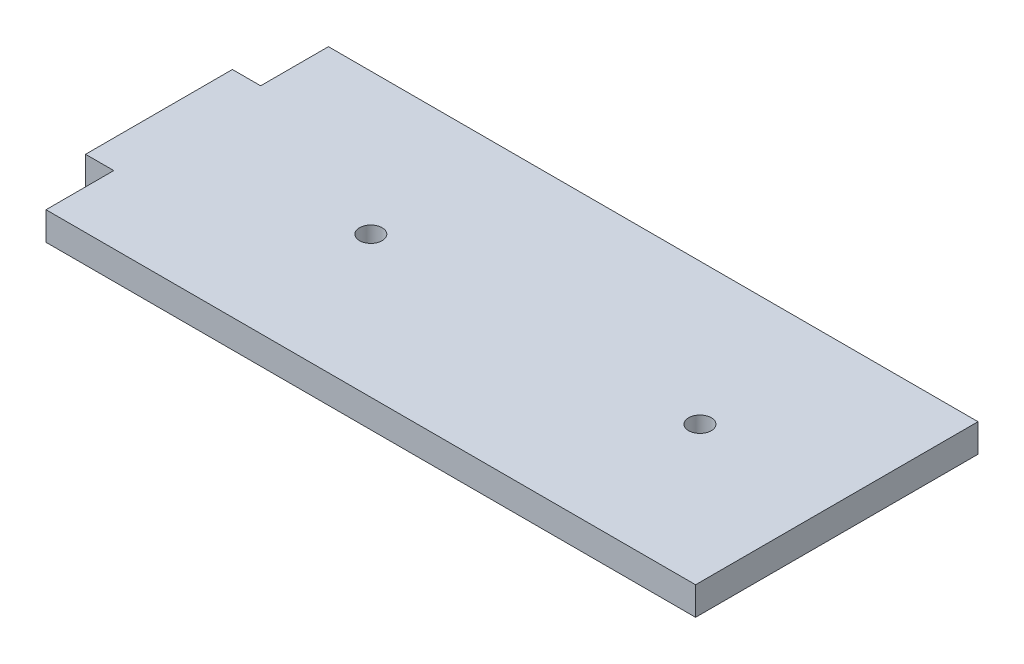
ISO-10303-21;
HEADER;
FILE_DESCRIPTION(('STEP AP214'),'2;1');
FILE_NAME('part.step','',(''),(''),'','','');
FILE_SCHEMA(('AUTOMOTIVE_DESIGN { 1 0 10303 214 1 1 1 1 }'));
ENDSEC;
DATA;
#1=APPLICATION_CONTEXT('core data for automotive mechanical design processes');
#2=APPLICATION_PROTOCOL_DEFINITION('international standard','automotive_design',2000,#1);
#3=PRODUCT_CONTEXT('',#1,'mechanical');
#4=PRODUCT('Part','Part','',(#3));
#5=PRODUCT_RELATED_PRODUCT_CATEGORY('part','',(#4));
#6=PRODUCT_DEFINITION_FORMATION('','',#4);
#7=PRODUCT_DEFINITION_CONTEXT('part definition',#1,'design');
#8=PRODUCT_DEFINITION('design','',#6,#7);
#9=PRODUCT_DEFINITION_SHAPE('','',#8);
#10=(LENGTH_UNIT() NAMED_UNIT(*) SI_UNIT(.MILLI.,.METRE.));
#11=(NAMED_UNIT(*) PLANE_ANGLE_UNIT() SI_UNIT($,.RADIAN.));
#12=(NAMED_UNIT(*) SI_UNIT($,.STERADIAN.) SOLID_ANGLE_UNIT());
#13=UNCERTAINTY_MEASURE_WITH_UNIT(LENGTH_MEASURE(1.E-05),#10,'distance_accuracy_value','');
#14=(GEOMETRIC_REPRESENTATION_CONTEXT(3) GLOBAL_UNCERTAINTY_ASSIGNED_CONTEXT((#13)) GLOBAL_UNIT_ASSIGNED_CONTEXT((#10,
#11,#12)) REPRESENTATION_CONTEXT('',''));
#15=CARTESIAN_POINT('',(0.,0.,0.));
#16=DIRECTION('',(0.,0.,1.));
#17=DIRECTION('',(1.,0.,0.));
#18=AXIS2_PLACEMENT_3D('',#15,#16,#17);
#19=CARTESIAN_POINT('',(38.1,3.175,-15.875));
#20=DIRECTION('',(-1.,0.,0.));
#21=DIRECTION('',(0.,0.,1.));
#22=AXIS2_PLACEMENT_3D('',#19,#20,#21);
#23=PLANE('',#22);
#24=DIRECTION('',(0.,0.,-1.));
#25=VECTOR('',#24,1.);
#26=CARTESIAN_POINT('',(38.1,0.,-15.875));
#27=LINE('',#26,#25);
#28=CARTESIAN_POINT('',(38.1,0.,15.875));
#29=VERTEX_POINT('',#28);
#30=CARTESIAN_POINT('',(38.1,0.,-15.875));
#31=VERTEX_POINT('',#30);
#32=EDGE_CURVE('E143',#29,#31,#27,.T.);
#33=ORIENTED_EDGE('',*,*,#32,.T.);
#34=DIRECTION('',(0.,-1.,0.));
#35=VECTOR('',#34,1.);
#36=CARTESIAN_POINT('',(38.1,3.175,-15.875));
#37=LINE('',#36,#35);
#38=CARTESIAN_POINT('',(38.1,3.175,-15.875));
#39=VERTEX_POINT('',#38);
#40=EDGE_CURVE('E11',#39,#31,#37,.T.);
#41=ORIENTED_EDGE('',*,*,#40,.F.);
#42=DIRECTION('',(0.,0.,-1.));
#43=VECTOR('',#42,1.);
#44=CARTESIAN_POINT('',(38.1,3.175,-15.875));
#45=LINE('',#44,#43);
#46=CARTESIAN_POINT('',(38.1,3.175,15.875));
#47=VERTEX_POINT('',#46);
#48=EDGE_CURVE('E147',#47,#39,#45,.T.);
#49=ORIENTED_EDGE('',*,*,#48,.F.);
#50=DIRECTION('',(0.,-1.,0.));
#51=VECTOR('',#50,1.);
#52=CARTESIAN_POINT('',(38.1,3.175,15.875));
#53=LINE('',#52,#51);
#54=EDGE_CURVE('E42',#47,#29,#53,.T.);
#55=ORIENTED_EDGE('',*,*,#54,.T.);
#56=EDGE_LOOP('',(#33,#41,#49,#55));
#57=FACE_BOUND('',#56,.T.);
#58=ADVANCED_FACE('F35',(#57),#23,.F.);
#59=CARTESIAN_POINT('',(-38.1,3.175,-15.875));
#60=DIRECTION('',(0.,0.,1.));
#61=DIRECTION('',(1.,0.,0.));
#62=AXIS2_PLACEMENT_3D('',#59,#60,#61);
#63=PLANE('',#62);
#64=DIRECTION('',(-1.,0.,0.));
#65=VECTOR('',#64,1.);
#66=CARTESIAN_POINT('',(-38.1,0.,-15.875));
#67=LINE('',#66,#65);
#68=CARTESIAN_POINT('',(-34.925,0.,-15.875));
#69=VERTEX_POINT('',#68);
#70=EDGE_CURVE('E160',#31,#69,#67,.T.);
#71=ORIENTED_EDGE('',*,*,#70,.T.);
#72=DIRECTION('',(0.,1.,0.));
#73=VECTOR('',#72,1.);
#74=CARTESIAN_POINT('',(-34.925,0.,-15.875));
#75=LINE('',#74,#73);
#76=CARTESIAN_POINT('',(-34.925,3.175,-15.875));
#77=VERTEX_POINT('',#76);
#78=EDGE_CURVE('E140',#69,#77,#75,.T.);
#79=ORIENTED_EDGE('',*,*,#78,.T.);
#80=DIRECTION('',(-1.,0.,0.));
#81=VECTOR('',#80,1.);
#82=CARTESIAN_POINT('',(-38.1,3.175,-15.875));
#83=LINE('',#82,#81);
#84=EDGE_CURVE('E150',#39,#77,#83,.T.);
#85=ORIENTED_EDGE('',*,*,#84,.F.);
#86=ORIENTED_EDGE('',*,*,#40,.T.);
#87=EDGE_LOOP('',(#71,#79,#85,#86));
#88=FACE_BOUND('',#87,.T.);
#89=ADVANCED_FACE('F173',(#88),#63,.F.);
#90=CARTESIAN_POINT('',(-38.1,3.175,-15.875));
#91=DIRECTION('',(1.,0.,0.));
#92=DIRECTION('',(0.,0.,-1.));
#93=AXIS2_PLACEMENT_3D('',#90,#91,#92);
#94=PLANE('',#93);
#95=DIRECTION('',(0.,0.,1.));
#96=VECTOR('',#95,1.);
#97=CARTESIAN_POINT('',(-38.1,0.,-15.875));
#98=LINE('',#97,#96);
#99=CARTESIAN_POINT('',(-38.1,0.,-8.255));
#100=VERTEX_POINT('',#99);
#101=CARTESIAN_POINT('',(-38.1,0.,8.25500000000001));
#102=VERTEX_POINT('',#101);
#103=EDGE_CURVE('E163',#100,#102,#98,.T.);
#104=ORIENTED_EDGE('',*,*,#103,.T.);
#105=DIRECTION('',(0.,1.,0.));
#106=VECTOR('',#105,1.);
#107=CARTESIAN_POINT('',(-38.1,0.,8.25500000000001));
#108=LINE('',#107,#106);
#109=CARTESIAN_POINT('',(-38.1,3.175,8.25500000000001));
#110=VERTEX_POINT('',#109);
#111=EDGE_CURVE('E49',#102,#110,#108,.T.);
#112=ORIENTED_EDGE('',*,*,#111,.T.);
#113=DIRECTION('',(0.,0.,1.));
#114=VECTOR('',#113,1.);
#115=CARTESIAN_POINT('',(-38.1,3.175,-15.875));
#116=LINE('',#115,#114);
#117=CARTESIAN_POINT('',(-38.1,3.175,-8.255));
#118=VERTEX_POINT('',#117);
#119=EDGE_CURVE('E153',#118,#110,#116,.T.);
#120=ORIENTED_EDGE('',*,*,#119,.F.);
#121=DIRECTION('',(0.,1.,0.));
#122=VECTOR('',#121,1.);
#123=CARTESIAN_POINT('',(-38.1,0.,-8.255));
#124=LINE('',#123,#122);
#125=EDGE_CURVE('E136',#100,#118,#124,.T.);
#126=ORIENTED_EDGE('',*,*,#125,.F.);
#127=EDGE_LOOP('',(#104,#112,#120,#126));
#128=FACE_BOUND('',#127,.T.);
#129=ADVANCED_FACE('F179',(#128),#94,.F.);
#130=CARTESIAN_POINT('',(-38.1,3.175,15.875));
#131=DIRECTION('',(0.,0.,-1.));
#132=DIRECTION('',(-1.,0.,0.));
#133=AXIS2_PLACEMENT_3D('',#130,#131,#132);
#134=PLANE('',#133);
#135=DIRECTION('',(1.,0.,0.));
#136=VECTOR('',#135,1.);
#137=CARTESIAN_POINT('',(-38.1,3.175,15.875));
#138=LINE('',#137,#136);
#139=CARTESIAN_POINT('',(-34.925,3.175,15.875));
#140=VERTEX_POINT('',#139);
#141=EDGE_CURVE('E156',#140,#47,#138,.T.);
#142=ORIENTED_EDGE('',*,*,#141,.F.);
#143=DIRECTION('',(0.,1.,0.));
#144=VECTOR('',#143,1.);
#145=CARTESIAN_POINT('',(-34.925,0.,15.875));
#146=LINE('',#145,#144);
#147=CARTESIAN_POINT('',(-34.925,0.,15.875));
#148=VERTEX_POINT('',#147);
#149=EDGE_CURVE('E127',#148,#140,#146,.T.);
#150=ORIENTED_EDGE('',*,*,#149,.F.);
#151=DIRECTION('',(1.,0.,0.));
#152=VECTOR('',#151,1.);
#153=CARTESIAN_POINT('',(-38.1,0.,15.875));
#154=LINE('',#153,#152);
#155=EDGE_CURVE('E117',#148,#29,#154,.T.);
#156=ORIENTED_EDGE('',*,*,#155,.T.);
#157=ORIENTED_EDGE('',*,*,#54,.F.);
#158=EDGE_LOOP('',(#142,#150,#156,#157));
#159=FACE_BOUND('',#158,.T.);
#160=ADVANCED_FACE('F177',(#159),#134,.F.);
#161=CARTESIAN_POINT('',(0.,3.175,0.));
#162=DIRECTION('',(0.,1.,0.));
#163=DIRECTION('',(0.,0.,1.));
#164=AXIS2_PLACEMENT_3D('',#161,#162,#163);
#165=PLANE('',#164);
#166=CARTESIAN_POINT('',(22.7196874789622,3.175,0.));
#167=DIRECTION('',(0.,1.,0.));
#168=DIRECTION('',(0.,0.,1.));
#169=AXIS2_PLACEMENT_3D('',#166,#167,#168);
#170=CIRCLE('',#169,1.27);
#171=CARTESIAN_POINT('',(22.7196874789622,3.175,1.27));
#172=VERTEX_POINT('',#171);
#173=EDGE_CURVE('E283',#172,#172,#170,.T.);
#174=ORIENTED_EDGE('',*,*,#173,.F.);
#175=EDGE_LOOP('',(#174));
#176=FACE_BOUND('',#175,.T.);
#177=CARTESIAN_POINT('',(-14.2803125210378,3.175,0.));
#178=DIRECTION('',(0.,1.,0.));
#179=DIRECTION('',(0.,0.,1.));
#180=AXIS2_PLACEMENT_3D('',#177,#178,#179);
#181=CIRCLE('',#180,1.27);
#182=CARTESIAN_POINT('',(-14.2803125210378,3.175,1.27));
#183=VERTEX_POINT('',#182);
#184=EDGE_CURVE('E122',#183,#183,#181,.T.);
#185=ORIENTED_EDGE('',*,*,#184,.F.);
#186=EDGE_LOOP('',(#185));
#187=FACE_BOUND('',#186,.T.);
#188=DIRECTION('',(0.,0.,-1.));
#189=VECTOR('',#188,1.);
#190=CARTESIAN_POINT('',(-34.925,3.175,8.25500000000001));
#191=LINE('',#190,#189);
#192=CARTESIAN_POINT('',(-34.925,3.175,8.25500000000001));
#193=VERTEX_POINT('',#192);
#194=EDGE_CURVE('E105',#140,#193,#191,.T.);
#195=ORIENTED_EDGE('',*,*,#194,.F.);
#196=ORIENTED_EDGE('',*,*,#141,.T.);
#197=ORIENTED_EDGE('',*,*,#48,.T.);
#198=ORIENTED_EDGE('',*,*,#84,.T.);
#199=DIRECTION('',(0.,0.,-1.));
#200=VECTOR('',#199,1.);
#201=CARTESIAN_POINT('',(-34.925,3.175,-8.255));
#202=LINE('',#201,#200);
#203=CARTESIAN_POINT('',(-34.925,3.175,-8.255));
#204=VERTEX_POINT('',#203);
#205=EDGE_CURVE('E134',#204,#77,#202,.T.);
#206=ORIENTED_EDGE('',*,*,#205,.F.);
#207=DIRECTION('',(1.,0.,0.));
#208=VECTOR('',#207,1.);
#209=CARTESIAN_POINT('',(-34.925,3.175,-8.255));
#210=LINE('',#209,#208);
#211=EDGE_CURVE('E129',#118,#204,#210,.T.);
#212=ORIENTED_EDGE('',*,*,#211,.F.);
#213=ORIENTED_EDGE('',*,*,#119,.T.);
#214=DIRECTION('',(-1.,0.,0.));
#215=VECTOR('',#214,1.);
#216=CARTESIAN_POINT('',(-34.925,3.175,8.25500000000001));
#217=LINE('',#216,#215);
#218=EDGE_CURVE('E118',#193,#110,#217,.T.);
#219=ORIENTED_EDGE('',*,*,#218,.F.);
#220=EDGE_LOOP('',(#195,#196,#197,#198,#206,#212,#213,#219));
#221=FACE_BOUND('',#220,.T.);
#222=ADVANCED_FACE('F176',(#176,#187,#221),#165,.T.);
#223=CARTESIAN_POINT('',(0.,0.,0.));
#224=DIRECTION('',(0.,1.,0.));
#225=DIRECTION('',(0.,0.,1.));
#226=AXIS2_PLACEMENT_3D('',#223,#224,#225);
#227=PLANE('',#226);
#228=CARTESIAN_POINT('',(22.7196874789622,0.,0.));
#229=DIRECTION('',(0.,1.,0.));
#230=DIRECTION('',(0.,0.,1.));
#231=AXIS2_PLACEMENT_3D('',#228,#229,#230);
#232=CIRCLE('',#231,1.27);
#233=CARTESIAN_POINT('',(22.7196874789622,0.,1.27));
#234=VERTEX_POINT('',#233);
#235=EDGE_CURVE('E280',#234,#234,#232,.T.);
#236=ORIENTED_EDGE('',*,*,#235,.T.);
#237=EDGE_LOOP('',(#236));
#238=FACE_BOUND('',#237,.T.);
#239=CARTESIAN_POINT('',(-14.2803125210378,0.,0.));
#240=DIRECTION('',(0.,1.,0.));
#241=DIRECTION('',(0.,0.,1.));
#242=AXIS2_PLACEMENT_3D('',#239,#240,#241);
#243=CIRCLE('',#242,1.27);
#244=CARTESIAN_POINT('',(-14.2803125210378,0.,1.27));
#245=VERTEX_POINT('',#244);
#246=EDGE_CURVE('E125',#245,#245,#243,.T.);
#247=ORIENTED_EDGE('',*,*,#246,.T.);
#248=EDGE_LOOP('',(#247));
#249=FACE_BOUND('',#248,.T.);
#250=ORIENTED_EDGE('',*,*,#155,.F.);
#251=DIRECTION('',(0.,0.,-1.));
#252=VECTOR('',#251,1.);
#253=CARTESIAN_POINT('',(-34.925,0.,8.25500000000001));
#254=LINE('',#253,#252);
#255=CARTESIAN_POINT('',(-34.925,0.,8.25500000000001));
#256=VERTEX_POINT('',#255);
#257=EDGE_CURVE('E102',#148,#256,#254,.T.);
#258=ORIENTED_EDGE('',*,*,#257,.T.);
#259=DIRECTION('',(-1.,0.,0.));
#260=VECTOR('',#259,1.);
#261=CARTESIAN_POINT('',(-34.925,0.,8.25500000000001));
#262=LINE('',#261,#260);
#263=EDGE_CURVE('E107',#256,#102,#262,.T.);
#264=ORIENTED_EDGE('',*,*,#263,.T.);
#265=ORIENTED_EDGE('',*,*,#103,.F.);
#266=DIRECTION('',(1.,0.,0.));
#267=VECTOR('',#266,1.);
#268=CARTESIAN_POINT('',(-34.925,0.,-8.255));
#269=LINE('',#268,#267);
#270=CARTESIAN_POINT('',(-34.925,0.,-8.255));
#271=VERTEX_POINT('',#270);
#272=EDGE_CURVE('E131',#100,#271,#269,.T.);
#273=ORIENTED_EDGE('',*,*,#272,.T.);
#274=DIRECTION('',(0.,0.,-1.));
#275=VECTOR('',#274,1.);
#276=CARTESIAN_POINT('',(-34.925,0.,-8.255));
#277=LINE('',#276,#275);
#278=EDGE_CURVE('E57',#271,#69,#277,.T.);
#279=ORIENTED_EDGE('',*,*,#278,.T.);
#280=ORIENTED_EDGE('',*,*,#70,.F.);
#281=ORIENTED_EDGE('',*,*,#32,.F.);
#282=EDGE_LOOP('',(#250,#258,#264,#265,#273,#279,#280,#281));
#283=FACE_BOUND('',#282,.T.);
#284=ADVANCED_FACE('F115',(#238,#249,#283),#227,.F.);
#285=CARTESIAN_POINT('',(-34.925,0.,-8.255));
#286=DIRECTION('',(1.,0.,0.));
#287=DIRECTION('',(0.,0.,-1.));
#288=AXIS2_PLACEMENT_3D('',#285,#286,#287);
#289=PLANE('',#288);
#290=ORIENTED_EDGE('',*,*,#205,.T.);
#291=ORIENTED_EDGE('',*,*,#78,.F.);
#292=ORIENTED_EDGE('',*,*,#278,.F.);
#293=DIRECTION('',(0.,1.,0.));
#294=VECTOR('',#293,1.);
#295=CARTESIAN_POINT('',(-34.925,0.,-8.255));
#296=LINE('',#295,#294);
#297=EDGE_CURVE('E144',#271,#204,#296,.T.);
#298=ORIENTED_EDGE('',*,*,#297,.T.);
#299=EDGE_LOOP('',(#290,#291,#292,#298));
#300=FACE_BOUND('',#299,.T.);
#301=ADVANCED_FACE('F219',(#300),#289,.F.);
#302=CARTESIAN_POINT('',(-34.925,0.,-8.255));
#303=DIRECTION('',(0.,0.,1.));
#304=DIRECTION('',(1.,0.,0.));
#305=AXIS2_PLACEMENT_3D('',#302,#303,#304);
#306=PLANE('',#305);
#307=ORIENTED_EDGE('',*,*,#211,.T.);
#308=ORIENTED_EDGE('',*,*,#297,.F.);
#309=ORIENTED_EDGE('',*,*,#272,.F.);
#310=ORIENTED_EDGE('',*,*,#125,.T.);
#311=EDGE_LOOP('',(#307,#308,#309,#310));
#312=FACE_BOUND('',#311,.T.);
#313=ADVANCED_FACE('F228',(#312),#306,.F.);
#314=CARTESIAN_POINT('',(-34.925,0.,8.25500000000001));
#315=DIRECTION('',(1.,0.,0.));
#316=DIRECTION('',(0.,0.,-1.));
#317=AXIS2_PLACEMENT_3D('',#314,#315,#316);
#318=PLANE('',#317);
#319=ORIENTED_EDGE('',*,*,#194,.T.);
#320=DIRECTION('',(0.,1.,0.));
#321=VECTOR('',#320,1.);
#322=CARTESIAN_POINT('',(-34.925,0.,8.25500000000001));
#323=LINE('',#322,#321);
#324=EDGE_CURVE('E99',#256,#193,#323,.T.);
#325=ORIENTED_EDGE('',*,*,#324,.F.);
#326=ORIENTED_EDGE('',*,*,#257,.F.);
#327=ORIENTED_EDGE('',*,*,#149,.T.);
#328=EDGE_LOOP('',(#319,#325,#326,#327));
#329=FACE_BOUND('',#328,.T.);
#330=ADVANCED_FACE('F100',(#329),#318,.F.);
#331=CARTESIAN_POINT('',(-34.925,0.,8.25500000000001));
#332=DIRECTION('',(0.,0.,-1.));
#333=DIRECTION('',(-1.,0.,0.));
#334=AXIS2_PLACEMENT_3D('',#331,#332,#333);
#335=PLANE('',#334);
#336=ORIENTED_EDGE('',*,*,#218,.T.);
#337=ORIENTED_EDGE('',*,*,#111,.F.);
#338=ORIENTED_EDGE('',*,*,#263,.F.);
#339=ORIENTED_EDGE('',*,*,#324,.T.);
#340=EDGE_LOOP('',(#336,#337,#338,#339));
#341=FACE_BOUND('',#340,.T.);
#342=ADVANCED_FACE('F109',(#341),#335,.F.);
#343=CARTESIAN_POINT('',(-14.2803125210378,0.,0.));
#344=DIRECTION('',(0.,1.,0.));
#345=DIRECTION('',(0.,0.,1.));
#346=AXIS2_PLACEMENT_3D('',#343,#344,#345);
#347=CYLINDRICAL_SURFACE('',#346,1.27);
#348=ORIENTED_EDGE('',*,*,#246,.F.);
#349=EDGE_LOOP('',(#348));
#350=FACE_BOUND('',#349,.T.);
#351=ORIENTED_EDGE('',*,*,#184,.T.);
#352=EDGE_LOOP('',(#351));
#353=FACE_BOUND('',#352,.T.);
#354=ADVANCED_FACE('F254',(#350,#353),#347,.F.);
#355=CARTESIAN_POINT('',(22.7196874789622,0.,0.));
#356=DIRECTION('',(0.,1.,0.));
#357=DIRECTION('',(0.,0.,1.));
#358=AXIS2_PLACEMENT_3D('',#355,#356,#357);
#359=CYLINDRICAL_SURFACE('',#358,1.27);
#360=ORIENTED_EDGE('',*,*,#235,.F.);
#361=EDGE_LOOP('',(#360));
#362=FACE_BOUND('',#361,.T.);
#363=ORIENTED_EDGE('',*,*,#173,.T.);
#364=EDGE_LOOP('',(#363));
#365=FACE_BOUND('',#364,.T.);
#366=ADVANCED_FACE('F263',(#362,#365),#359,.F.);
#367=CLOSED_SHELL('',(#58,#89,#129,#160,#222,#284,#301,#313,#330,#342,#354,#366));
#368=MANIFOLD_SOLID_BREP('B2',#367);
#369=ADVANCED_BREP_SHAPE_REPRESENTATION('',(#18,#368),#14);
#370=SHAPE_DEFINITION_REPRESENTATION(#9,#369);
ENDSEC;
END-ISO-10303-21;
